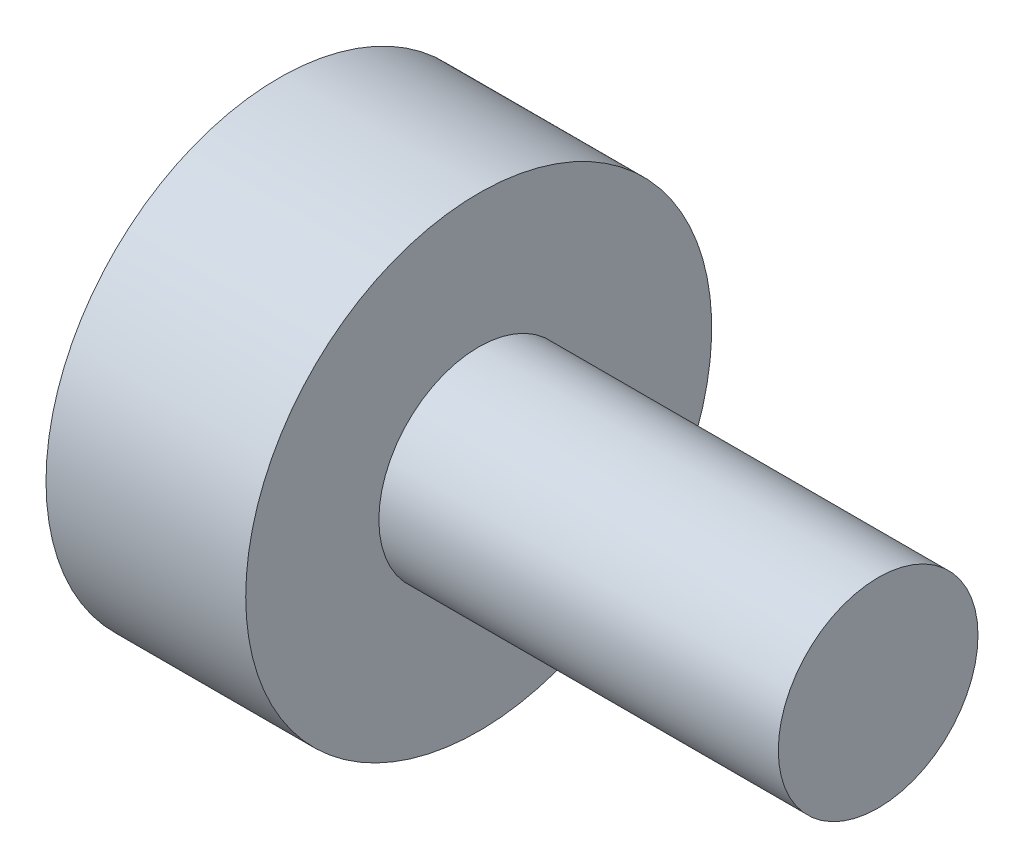
ISO-10303-21;
HEADER;
FILE_DESCRIPTION(('STEP AP214'),'2;1');
FILE_NAME('part.step','',(''),(''),'','','');
FILE_SCHEMA(('AUTOMOTIVE_DESIGN { 1 0 10303 214 1 1 1 1 }'));
ENDSEC;
DATA;
#1=APPLICATION_CONTEXT('core data for automotive mechanical design processes');
#2=APPLICATION_PROTOCOL_DEFINITION('international standard','automotive_design',2000,#1);
#3=PRODUCT_CONTEXT('',#1,'mechanical');
#4=PRODUCT('Part','Part','',(#3));
#5=PRODUCT_RELATED_PRODUCT_CATEGORY('part','',(#4));
#6=PRODUCT_DEFINITION_FORMATION('','',#4);
#7=PRODUCT_DEFINITION_CONTEXT('part definition',#1,'design');
#8=PRODUCT_DEFINITION('design','',#6,#7);
#9=PRODUCT_DEFINITION_SHAPE('','',#8);
#10=(LENGTH_UNIT() NAMED_UNIT(*) SI_UNIT(.MILLI.,.METRE.));
#11=(NAMED_UNIT(*) PLANE_ANGLE_UNIT() SI_UNIT($,.RADIAN.));
#12=(NAMED_UNIT(*) SI_UNIT($,.STERADIAN.) SOLID_ANGLE_UNIT());
#13=UNCERTAINTY_MEASURE_WITH_UNIT(LENGTH_MEASURE(1.E-05),#10,'distance_accuracy_value','');
#14=(GEOMETRIC_REPRESENTATION_CONTEXT(3) GLOBAL_UNCERTAINTY_ASSIGNED_CONTEXT((#13)) GLOBAL_UNIT_ASSIGNED_CONTEXT((#10,
#11,#12)) REPRESENTATION_CONTEXT('',''));
#15=CARTESIAN_POINT('',(0.,0.,0.));
#16=DIRECTION('',(0.,0.,1.));
#17=DIRECTION('',(1.,0.,0.));
#18=AXIS2_PLACEMENT_3D('',#15,#16,#17);
#19=CARTESIAN_POINT('',(0.,0.,0.));
#20=DIRECTION('',(1.,0.,0.));
#21=DIRECTION('',(0.,0.,-1.));
#22=AXIS2_PLACEMENT_3D('',#19,#20,#21);
#23=PLANE('',#22);
#24=CARTESIAN_POINT('',(0.,0.,-10.));
#25=DIRECTION('',(1.,0.,0.));
#26=DIRECTION('',(0.,0.,-1.));
#27=AXIS2_PLACEMENT_3D('',#24,#25,#26);
#28=CIRCLE('',#27,5.);
#29=CARTESIAN_POINT('',(0.,0.,-15.));
#30=VERTEX_POINT('',#29);
#31=EDGE_CURVE('E63',#30,#30,#28,.T.);
#32=ORIENTED_EDGE('',*,*,#31,.T.);
#33=EDGE_LOOP('',(#32));
#34=FACE_BOUND('',#33,.T.);
#35=CARTESIAN_POINT('',(0.,0.,0.));
#36=DIRECTION('',(-1.,0.,0.));
#37=DIRECTION('',(0.,0.,1.));
#38=AXIS2_PLACEMENT_3D('',#35,#36,#37);
#39=CIRCLE('',#38,20.);
#40=CARTESIAN_POINT('',(0.,0.,20.));
#41=VERTEX_POINT('',#40);
#42=EDGE_CURVE('E10',#41,#41,#39,.T.);
#43=ORIENTED_EDGE('',*,*,#42,.T.);
#44=EDGE_LOOP('',(#43));
#45=FACE_BOUND('',#44,.T.);
#46=ADVANCED_FACE('F37',(#34,#45),#23,.F.);
#47=CARTESIAN_POINT('',(0.,0.,0.));
#48=DIRECTION('',(-1.,0.,0.));
#49=DIRECTION('',(0.,0.,1.));
#50=AXIS2_PLACEMENT_3D('',#47,#48,#49);
#51=CYLINDRICAL_SURFACE('',#50,20.);
#52=ORIENTED_EDGE('',*,*,#42,.F.);
#53=EDGE_LOOP('',(#52));
#54=FACE_BOUND('',#53,.T.);
#55=CARTESIAN_POINT('',(10.,0.,0.));
#56=DIRECTION('',(-1.,0.,0.));
#57=DIRECTION('',(0.,0.,1.));
#58=AXIS2_PLACEMENT_3D('',#55,#56,#57);
#59=CIRCLE('',#58,20.);
#60=CARTESIAN_POINT('',(10.,0.,20.));
#61=VERTEX_POINT('',#60);
#62=EDGE_CURVE('E43',#61,#61,#59,.T.);
#63=ORIENTED_EDGE('',*,*,#62,.T.);
#64=EDGE_LOOP('',(#63));
#65=FACE_BOUND('',#64,.T.);
#66=ADVANCED_FACE('F81',(#54,#65),#51,.T.);
#67=CARTESIAN_POINT('',(10.,20.,0.));
#68=DIRECTION('',(1.,0.,0.));
#69=DIRECTION('',(0.,0.,-1.));
#70=AXIS2_PLACEMENT_3D('',#67,#68,#69);
#71=PLANE('',#70);
#72=ORIENTED_EDGE('',*,*,#62,.F.);
#73=EDGE_LOOP('',(#72));
#74=FACE_BOUND('',#73,.T.);
#75=CARTESIAN_POINT('',(10.,0.,0.));
#76=DIRECTION('',(-1.,0.,0.));
#77=DIRECTION('',(0.,0.,1.));
#78=AXIS2_PLACEMENT_3D('',#75,#76,#77);
#79=CIRCLE('',#78,35.);
#80=CARTESIAN_POINT('',(10.,0.,35.));
#81=VERTEX_POINT('',#80);
#82=EDGE_CURVE('E47',#81,#81,#79,.T.);
#83=ORIENTED_EDGE('',*,*,#82,.T.);
#84=EDGE_LOOP('',(#83));
#85=FACE_BOUND('',#84,.T.);
#86=ADVANCED_FACE('F87',(#74,#85),#71,.F.);
#87=CARTESIAN_POINT('',(0.,0.,0.));
#88=DIRECTION('',(-1.,0.,0.));
#89=DIRECTION('',(0.,0.,1.));
#90=AXIS2_PLACEMENT_3D('',#87,#88,#89);
#91=CYLINDRICAL_SURFACE('',#90,35.);
#92=ORIENTED_EDGE('',*,*,#82,.F.);
#93=EDGE_LOOP('',(#92));
#94=FACE_BOUND('',#93,.T.);
#95=CARTESIAN_POINT('',(40.,0.,0.));
#96=DIRECTION('',(-1.,0.,0.));
#97=DIRECTION('',(0.,0.,1.));
#98=AXIS2_PLACEMENT_3D('',#95,#96,#97);
#99=CIRCLE('',#98,35.);
#100=CARTESIAN_POINT('',(40.,0.,35.));
#101=VERTEX_POINT('',#100);
#102=EDGE_CURVE('E51',#101,#101,#99,.T.);
#103=ORIENTED_EDGE('',*,*,#102,.T.);
#104=EDGE_LOOP('',(#103));
#105=FACE_BOUND('',#104,.T.);
#106=ADVANCED_FACE('F93',(#94,#105),#91,.T.);
#107=CARTESIAN_POINT('',(40.,35.,0.));
#108=DIRECTION('',(-1.,0.,0.));
#109=DIRECTION('',(0.,0.,1.));
#110=AXIS2_PLACEMENT_3D('',#107,#108,#109);
#111=PLANE('',#110);
#112=ORIENTED_EDGE('',*,*,#102,.F.);
#113=EDGE_LOOP('',(#112));
#114=FACE_BOUND('',#113,.T.);
#115=CARTESIAN_POINT('',(40.,0.,0.));
#116=DIRECTION('',(-1.,0.,0.));
#117=DIRECTION('',(0.,0.,1.));
#118=AXIS2_PLACEMENT_3D('',#115,#116,#117);
#119=CIRCLE('',#118,15.);
#120=CARTESIAN_POINT('',(40.,0.,15.));
#121=VERTEX_POINT('',#120);
#122=EDGE_CURVE('E56',#121,#121,#119,.T.);
#123=ORIENTED_EDGE('',*,*,#122,.T.);
#124=EDGE_LOOP('',(#123));
#125=FACE_BOUND('',#124,.T.);
#126=ADVANCED_FACE('F99',(#114,#125),#111,.F.);
#127=CARTESIAN_POINT('',(0.,0.,0.));
#128=DIRECTION('',(-1.,0.,0.));
#129=DIRECTION('',(0.,0.,1.));
#130=AXIS2_PLACEMENT_3D('',#127,#128,#129);
#131=CYLINDRICAL_SURFACE('',#130,15.);
#132=ORIENTED_EDGE('',*,*,#122,.F.);
#133=EDGE_LOOP('',(#132));
#134=FACE_BOUND('',#133,.T.);
#135=CARTESIAN_POINT('',(100.,0.,0.));
#136=DIRECTION('',(-1.,0.,0.));
#137=DIRECTION('',(0.,0.,1.));
#138=AXIS2_PLACEMENT_3D('',#135,#136,#137);
#139=CIRCLE('',#138,15.);
#140=CARTESIAN_POINT('',(100.,0.,15.));
#141=VERTEX_POINT('',#140);
#142=EDGE_CURVE('E59',#141,#141,#139,.T.);
#143=ORIENTED_EDGE('',*,*,#142,.T.);
#144=EDGE_LOOP('',(#143));
#145=FACE_BOUND('',#144,.T.);
#146=ADVANCED_FACE('F103',(#134,#145),#131,.T.);
#147=CARTESIAN_POINT('',(100.,0.,0.));
#148=DIRECTION('',(-1.,0.,0.));
#149=DIRECTION('',(0.,0.,1.));
#150=AXIS2_PLACEMENT_3D('',#147,#148,#149);
#151=PLANE('',#150);
#152=ORIENTED_EDGE('',*,*,#142,.F.);
#153=EDGE_LOOP('',(#152));
#154=FACE_BOUND('',#153,.T.);
#155=ADVANCED_FACE('F78',(#154),#151,.F.);
#156=CARTESIAN_POINT('',(20.,0.,-10.));
#157=DIRECTION('',(-1.,0.,0.));
#158=DIRECTION('',(0.,0.,1.));
#159=AXIS2_PLACEMENT_3D('',#156,#157,#158);
#160=CYLINDRICAL_SURFACE('',#159,5.);
#161=CARTESIAN_POINT('',(20.,0.,-10.));
#162=DIRECTION('',(1.,0.,0.));
#163=DIRECTION('',(0.,0.,-1.));
#164=AXIS2_PLACEMENT_3D('',#161,#162,#163);
#165=CIRCLE('',#164,5.);
#166=CARTESIAN_POINT('',(20.,0.,-15.));
#167=VERTEX_POINT('',#166);
#168=EDGE_CURVE('E62',#167,#167,#165,.T.);
#169=ORIENTED_EDGE('',*,*,#168,.T.);
#170=EDGE_LOOP('',(#169));
#171=FACE_BOUND('',#170,.T.);
#172=ORIENTED_EDGE('',*,*,#31,.F.);
#173=EDGE_LOOP('',(#172));
#174=FACE_BOUND('',#173,.T.);
#175=ADVANCED_FACE('F69',(#171,#174),#160,.F.);
#176=CARTESIAN_POINT('',(20.,0.,-10.));
#177=DIRECTION('',(1.,0.,0.));
#178=DIRECTION('',(0.,0.,-1.));
#179=AXIS2_PLACEMENT_3D('',#176,#177,#178);
#180=PLANE('',#179);
#181=ORIENTED_EDGE('',*,*,#168,.F.);
#182=EDGE_LOOP('',(#181));
#183=FACE_BOUND('',#182,.T.);
#184=ADVANCED_FACE('F72',(#183),#180,.F.);
#185=CLOSED_SHELL('',(#46,#66,#86,#106,#126,#146,#155,#175,#184));
#186=MANIFOLD_SOLID_BREP('B2',#185);
#187=ADVANCED_BREP_SHAPE_REPRESENTATION('',(#18,#186),#14);
#188=SHAPE_DEFINITION_REPRESENTATION(#9,#187);
ENDSEC;
END-ISO-10303-21;
